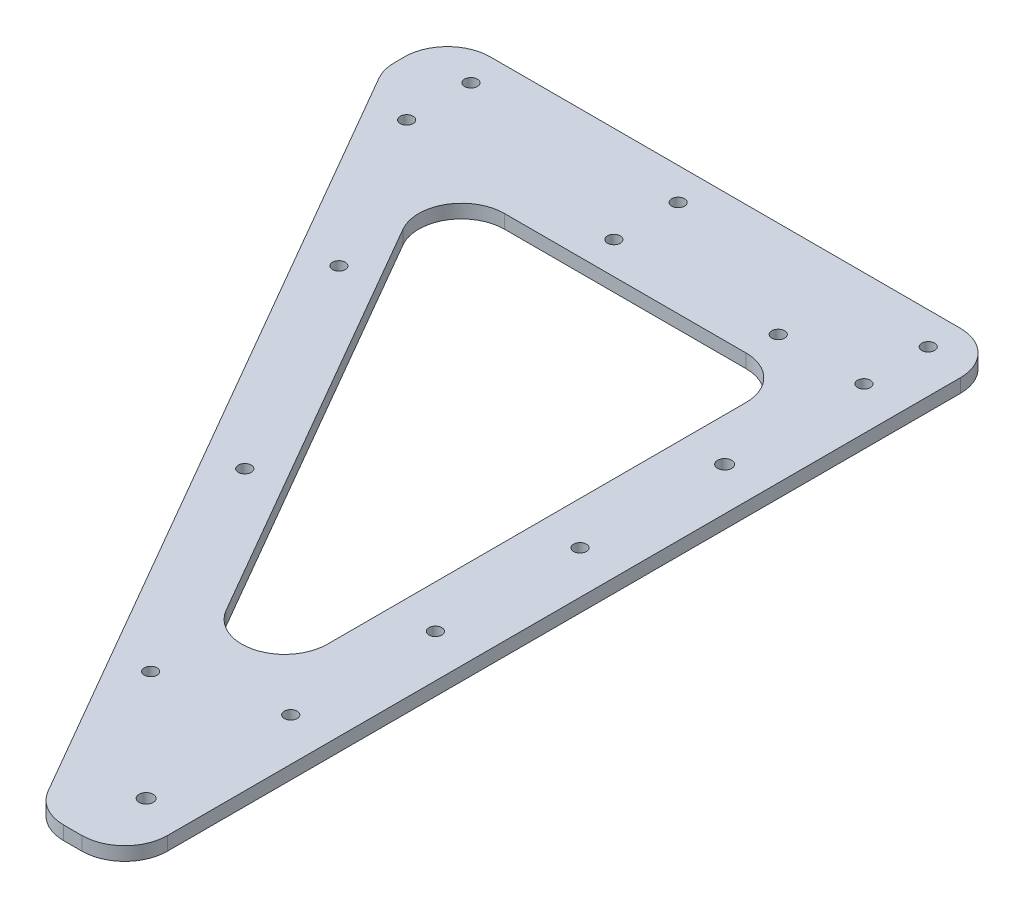
ISO-10303-21;
HEADER;
FILE_DESCRIPTION(('STEP AP214'),'2;1');
FILE_NAME('part.step','',(''),(''),'','','');
FILE_SCHEMA(('AUTOMOTIVE_DESIGN { 1 0 10303 214 1 1 1 1 }'));
ENDSEC;
DATA;
#1=APPLICATION_CONTEXT('core data for automotive mechanical design processes');
#2=APPLICATION_PROTOCOL_DEFINITION('international standard','automotive_design',2000,#1);
#3=PRODUCT_CONTEXT('',#1,'mechanical');
#4=PRODUCT('Part','Part','',(#3));
#5=PRODUCT_RELATED_PRODUCT_CATEGORY('part','',(#4));
#6=PRODUCT_DEFINITION_FORMATION('','',#4);
#7=PRODUCT_DEFINITION_CONTEXT('part definition',#1,'design');
#8=PRODUCT_DEFINITION('design','',#6,#7);
#9=PRODUCT_DEFINITION_SHAPE('','',#8);
#10=(LENGTH_UNIT() NAMED_UNIT(*) SI_UNIT(.MILLI.,.METRE.));
#11=(NAMED_UNIT(*) PLANE_ANGLE_UNIT() SI_UNIT($,.RADIAN.));
#12=(NAMED_UNIT(*) SI_UNIT($,.STERADIAN.) SOLID_ANGLE_UNIT());
#13=UNCERTAINTY_MEASURE_WITH_UNIT(LENGTH_MEASURE(1.E-05),#10,'distance_accuracy_value','');
#14=(GEOMETRIC_REPRESENTATION_CONTEXT(3) GLOBAL_UNCERTAINTY_ASSIGNED_CONTEXT((#13)) GLOBAL_UNIT_ASSIGNED_CONTEXT((#10,
#11,#12)) REPRESENTATION_CONTEXT('',''));
#15=CARTESIAN_POINT('',(0.,0.,0.));
#16=DIRECTION('',(0.,0.,1.));
#17=DIRECTION('',(1.,0.,0.));
#18=AXIS2_PLACEMENT_3D('',#15,#16,#17);
#19=CARTESIAN_POINT('',(-97.2724133595217,3.175,56.1602540378444));
#20=DIRECTION('',(-0.866025403784439,0.,0.5));
#21=DIRECTION('',(0.5,0.,0.866025403784439));
#22=AXIS2_PLACEMENT_3D('',#19,#20,#21);
#23=PLANE('',#22);
#24=DIRECTION('',(-0.5,0.,-0.866025403784439));
#25=VECTOR('',#24,1.);
#26=CARTESIAN_POINT('',(-97.2724133595217,0.,56.1602540378444));
#27=LINE('',#26,#25);
#28=CARTESIAN_POINT('',(-22.8867513459481,0.,185.));
#29=VERTEX_POINT('',#28);
#30=CARTESIAN_POINT('',(-128.356805183873,0.,2.32050807568877));
#31=VERTEX_POINT('',#30);
#32=EDGE_CURVE('E180',#29,#31,#27,.T.);
#33=ORIENTED_EDGE('',*,*,#32,.F.);
#34=DIRECTION('',(0.,-1.,0.));
#35=VECTOR('',#34,1.);
#36=CARTESIAN_POINT('',(-22.8867513459481,3.175,185.));
#37=LINE('',#36,#35);
#38=CARTESIAN_POINT('',(-22.8867513459481,3.175,185.));
#39=VERTEX_POINT('',#38);
#40=EDGE_CURVE('E160',#29,#39,#37,.F.);
#41=ORIENTED_EDGE('',*,*,#40,.T.);
#42=DIRECTION('',(-0.5,0.,-0.866025403784439));
#43=VECTOR('',#42,1.);
#44=CARTESIAN_POINT('',(-97.2724133595217,3.175,56.1602540378444));
#45=LINE('',#44,#43);
#46=CARTESIAN_POINT('',(-128.356805183873,3.175,2.32050807568877));
#47=VERTEX_POINT('',#46);
#48=EDGE_CURVE('E326',#39,#47,#45,.T.);
#49=ORIENTED_EDGE('',*,*,#48,.T.);
#50=DIRECTION('',(0.,-1.,0.));
#51=VECTOR('',#50,1.);
#52=CARTESIAN_POINT('',(-128.356805183873,3.175,2.32050807568877));
#53=LINE('',#52,#51);
#54=EDGE_CURVE('E258',#47,#31,#53,.T.);
#55=ORIENTED_EDGE('',*,*,#54,.T.);
#56=EDGE_LOOP('',(#33,#41,#49,#55));
#57=FACE_BOUND('',#56,.T.);
#58=ADVANCED_FACE('F35',(#57),#23,.T.);
#59=CARTESIAN_POINT('',(0.,3.175,190.));
#60=DIRECTION('',(0.,0.,1.));
#61=DIRECTION('',(1.,0.,0.));
#62=AXIS2_PLACEMENT_3D('',#59,#60,#61);
#63=PLANE('',#62);
#64=DIRECTION('',(-1.,0.,0.));
#65=VECTOR('',#64,1.);
#66=CARTESIAN_POINT('',(0.,0.,190.));
#67=LINE('',#66,#65);
#68=CARTESIAN_POINT('',(-9.99999999999998,0.,190.));
#69=VERTEX_POINT('',#68);
#70=CARTESIAN_POINT('',(-14.2264973081037,0.,190.));
#71=VERTEX_POINT('',#70);
#72=EDGE_CURVE('E188',#69,#71,#67,.T.);
#73=ORIENTED_EDGE('',*,*,#72,.F.);
#74=DIRECTION('',(0.,-1.,0.));
#75=VECTOR('',#74,1.);
#76=CARTESIAN_POINT('',(-9.99999999999998,3.175,190.));
#77=LINE('',#76,#75);
#78=CARTESIAN_POINT('',(-9.99999999999998,3.175,190.));
#79=VERTEX_POINT('',#78);
#80=EDGE_CURVE('E57',#69,#79,#77,.F.);
#81=ORIENTED_EDGE('',*,*,#80,.T.);
#82=DIRECTION('',(-1.,0.,0.));
#83=VECTOR('',#82,1.);
#84=CARTESIAN_POINT('',(0.,3.175,190.));
#85=LINE('',#84,#83);
#86=CARTESIAN_POINT('',(-14.2264973081037,3.175,190.));
#87=VERTEX_POINT('',#86);
#88=EDGE_CURVE('E324',#79,#87,#85,.T.);
#89=ORIENTED_EDGE('',*,*,#88,.T.);
#90=DIRECTION('',(0.,-1.,0.));
#91=VECTOR('',#90,1.);
#92=CARTESIAN_POINT('',(-14.2264973081037,3.175,190.));
#93=LINE('',#92,#91);
#94=EDGE_CURVE('E254',#87,#71,#93,.T.);
#95=ORIENTED_EDGE('',*,*,#94,.T.);
#96=EDGE_LOOP('',(#73,#81,#89,#95));
#97=FACE_BOUND('',#96,.T.);
#98=ADVANCED_FACE('F414',(#97),#63,.T.);
#99=CARTESIAN_POINT('',(0.,3.175,15.));
#100=DIRECTION('',(0.,0.,-1.));
#101=DIRECTION('',(-1.,0.,0.));
#102=AXIS2_PLACEMENT_3D('',#99,#100,#101);
#103=PLANE('',#102);
#104=DIRECTION('',(1.,0.,0.));
#105=VECTOR('',#104,1.);
#106=CARTESIAN_POINT('',(0.,0.,15.));
#107=LINE('',#106,#105);
#108=CARTESIAN_POINT('',(-86.3952809568069,0.,15.));
#109=VERTEX_POINT('',#108);
#110=CARTESIAN_POINT('',(-30.,0.,15.));
#111=VERTEX_POINT('',#110);
#112=EDGE_CURVE('E182',#109,#111,#107,.T.);
#113=ORIENTED_EDGE('',*,*,#112,.T.);
#114=DIRECTION('',(0.,-1.,0.));
#115=VECTOR('',#114,1.);
#116=CARTESIAN_POINT('',(-30.,3.175,15.));
#117=LINE('',#116,#115);
#118=CARTESIAN_POINT('',(-30.,3.175,15.));
#119=VERTEX_POINT('',#118);
#120=EDGE_CURVE('E218',#111,#119,#117,.F.);
#121=ORIENTED_EDGE('',*,*,#120,.T.);
#122=DIRECTION('',(1.,0.,0.));
#123=VECTOR('',#122,1.);
#124=CARTESIAN_POINT('',(0.,3.175,15.));
#125=LINE('',#124,#123);
#126=CARTESIAN_POINT('',(-86.3952809568069,3.175,15.));
#127=VERTEX_POINT('',#126);
#128=EDGE_CURVE('E275',#127,#119,#125,.T.);
#129=ORIENTED_EDGE('',*,*,#128,.F.);
#130=DIRECTION('',(0.,-1.,0.));
#131=VECTOR('',#130,1.);
#132=CARTESIAN_POINT('',(-86.3952809568069,0.,15.));
#133=LINE('',#132,#131);
#134=EDGE_CURVE('E215',#127,#109,#133,.T.);
#135=ORIENTED_EDGE('',*,*,#134,.T.);
#136=EDGE_LOOP('',(#113,#121,#129,#135));
#137=FACE_BOUND('',#136,.T.);
#138=ADVANCED_FACE('F285',(#137),#103,.F.);
#139=CARTESIAN_POINT('',(-20.,3.175,0.));
#140=DIRECTION('',(1.,0.,0.));
#141=DIRECTION('',(0.,0.,-1.));
#142=AXIS2_PLACEMENT_3D('',#139,#140,#141);
#143=PLANE('',#142);
#144=DIRECTION('',(0.,0.,1.));
#145=VECTOR('',#144,1.);
#146=CARTESIAN_POINT('',(-20.,0.,0.));
#147=LINE('',#146,#145);
#148=CARTESIAN_POINT('',(-20.,0.,25.));
#149=VERTEX_POINT('',#148);
#150=CARTESIAN_POINT('',(-20.,0.,122.679491924311));
#151=VERTEX_POINT('',#150);
#152=EDGE_CURVE('E177',#149,#151,#147,.T.);
#153=ORIENTED_EDGE('',*,*,#152,.T.);
#154=DIRECTION('',(0.,-1.,0.));
#155=VECTOR('',#154,1.);
#156=CARTESIAN_POINT('',(-20.,3.175,122.679491924311));
#157=LINE('',#156,#155);
#158=CARTESIAN_POINT('',(-20.,3.175,122.679491924311));
#159=VERTEX_POINT('',#158);
#160=EDGE_CURVE('E154',#151,#159,#157,.F.);
#161=ORIENTED_EDGE('',*,*,#160,.T.);
#162=DIRECTION('',(0.,0.,1.));
#163=VECTOR('',#162,1.);
#164=CARTESIAN_POINT('',(-20.,3.175,0.));
#165=LINE('',#164,#163);
#166=CARTESIAN_POINT('',(-20.,3.175,25.));
#167=VERTEX_POINT('',#166);
#168=EDGE_CURVE('E273',#167,#159,#165,.T.);
#169=ORIENTED_EDGE('',*,*,#168,.F.);
#170=DIRECTION('',(0.,-1.,0.));
#171=VECTOR('',#170,1.);
#172=CARTESIAN_POINT('',(-20.,0.,25.));
#173=LINE('',#172,#171);
#174=EDGE_CURVE('E170',#167,#149,#173,.T.);
#175=ORIENTED_EDGE('',*,*,#174,.T.);
#176=EDGE_LOOP('',(#153,#161,#169,#175));
#177=FACE_BOUND('',#176,.T.);
#178=ADVANCED_FACE('F280',(#177),#143,.F.);
#179=CARTESIAN_POINT('',(-9.99999999999997,3.175,40.));
#180=DIRECTION('',(0.,-1.,0.));
#181=DIRECTION('',(0.,0.,-1.));
#182=AXIS2_PLACEMENT_3D('',#179,#180,#181);
#183=CYLINDRICAL_SURFACE('',#182,1.65);
#184=CARTESIAN_POINT('',(-9.99999999999997,3.175,40.));
#185=DIRECTION('',(0.,1.,0.));
#186=DIRECTION('',(0.,0.,1.));
#187=AXIS2_PLACEMENT_3D('',#184,#185,#186);
#188=CIRCLE('',#187,1.65);
#189=CARTESIAN_POINT('',(-9.99999999999997,3.175,41.65));
#190=VERTEX_POINT('',#189);
#191=EDGE_CURVE('E309',#190,#190,#188,.T.);
#192=ORIENTED_EDGE('',*,*,#191,.T.);
#193=EDGE_LOOP('',(#192));
#194=FACE_BOUND('',#193,.T.);
#195=CARTESIAN_POINT('',(-9.99999999999997,0.,40.));
#196=DIRECTION('',(0.,1.,0.));
#197=DIRECTION('',(0.,0.,1.));
#198=AXIS2_PLACEMENT_3D('',#195,#196,#197);
#199=CIRCLE('',#198,1.65);
#200=CARTESIAN_POINT('',(-9.99999999999997,0.,41.65));
#201=VERTEX_POINT('',#200);
#202=EDGE_CURVE('E203',#201,#201,#199,.T.);
#203=ORIENTED_EDGE('',*,*,#202,.F.);
#204=EDGE_LOOP('',(#203));
#205=FACE_BOUND('',#204,.T.);
#206=ADVANCED_FACE('F434',(#194,#205),#183,.F.);
#207=CARTESIAN_POINT('',(-10.,3.175,141.25));
#208=DIRECTION('',(0.,-1.,0.));
#209=DIRECTION('',(0.,0.,-1.));
#210=AXIS2_PLACEMENT_3D('',#207,#208,#209);
#211=CYLINDRICAL_SURFACE('',#210,1.5);
#212=CARTESIAN_POINT('',(-10.,3.175,141.25));
#213=DIRECTION('',(0.,1.,0.));
#214=DIRECTION('',(0.,0.,1.));
#215=AXIS2_PLACEMENT_3D('',#212,#213,#214);
#216=CIRCLE('',#215,1.5);
#217=CARTESIAN_POINT('',(-10.,3.175,142.75));
#218=VERTEX_POINT('',#217);
#219=EDGE_CURVE('E312',#218,#218,#216,.T.);
#220=ORIENTED_EDGE('',*,*,#219,.T.);
#221=EDGE_LOOP('',(#220));
#222=FACE_BOUND('',#221,.T.);
#223=CARTESIAN_POINT('',(-10.,0.,141.25));
#224=DIRECTION('',(0.,1.,0.));
#225=DIRECTION('',(0.,0.,1.));
#226=AXIS2_PLACEMENT_3D('',#223,#224,#225);
#227=CIRCLE('',#226,1.5);
#228=CARTESIAN_POINT('',(-10.,0.,142.75));
#229=VERTEX_POINT('',#228);
#230=EDGE_CURVE('E200',#229,#229,#227,.T.);
#231=ORIENTED_EDGE('',*,*,#230,.F.);
#232=EDGE_LOOP('',(#231));
#233=FACE_BOUND('',#232,.T.);
#234=ADVANCED_FACE('F657',(#222,#233),#211,.F.);
#235=CARTESIAN_POINT('',(-9.99999999999997,3.175,107.5));
#236=DIRECTION('',(0.,-1.,0.));
#237=DIRECTION('',(0.,0.,-1.));
#238=AXIS2_PLACEMENT_3D('',#235,#236,#237);
#239=CYLINDRICAL_SURFACE('',#238,1.5);
#240=CARTESIAN_POINT('',(-9.99999999999997,3.175,107.5));
#241=DIRECTION('',(0.,1.,0.));
#242=DIRECTION('',(0.,0.,1.));
#243=AXIS2_PLACEMENT_3D('',#240,#241,#242);
#244=CIRCLE('',#243,1.5);
#245=CARTESIAN_POINT('',(-9.99999999999997,3.175,109.));
#246=VERTEX_POINT('',#245);
#247=EDGE_CURVE('E315',#246,#246,#244,.T.);
#248=ORIENTED_EDGE('',*,*,#247,.T.);
#249=EDGE_LOOP('',(#248));
#250=FACE_BOUND('',#249,.T.);
#251=CARTESIAN_POINT('',(-9.99999999999997,0.,107.5));
#252=DIRECTION('',(0.,1.,0.));
#253=DIRECTION('',(0.,0.,1.));
#254=AXIS2_PLACEMENT_3D('',#251,#252,#253);
#255=CIRCLE('',#254,1.5);
#256=CARTESIAN_POINT('',(-9.99999999999997,0.,109.));
#257=VERTEX_POINT('',#256);
#258=EDGE_CURVE('E197',#257,#257,#255,.T.);
#259=ORIENTED_EDGE('',*,*,#258,.F.);
#260=EDGE_LOOP('',(#259));
#261=FACE_BOUND('',#260,.T.);
#262=ADVANCED_FACE('F647',(#250,#261),#239,.F.);
#263=CARTESIAN_POINT('',(-10.,3.175,73.75));
#264=DIRECTION('',(0.,-1.,0.));
#265=DIRECTION('',(0.,0.,-1.));
#266=AXIS2_PLACEMENT_3D('',#263,#264,#265);
#267=CYLINDRICAL_SURFACE('',#266,1.5);
#268=CARTESIAN_POINT('',(-10.,3.175,73.75));
#269=DIRECTION('',(0.,1.,0.));
#270=DIRECTION('',(0.,0.,1.));
#271=AXIS2_PLACEMENT_3D('',#268,#269,#270);
#272=CIRCLE('',#271,1.5);
#273=CARTESIAN_POINT('',(-10.,3.175,75.25));
#274=VERTEX_POINT('',#273);
#275=EDGE_CURVE('E318',#274,#274,#272,.T.);
#276=ORIENTED_EDGE('',*,*,#275,.T.);
#277=EDGE_LOOP('',(#276));
#278=FACE_BOUND('',#277,.T.);
#279=CARTESIAN_POINT('',(-10.,0.,73.75));
#280=DIRECTION('',(0.,1.,0.));
#281=DIRECTION('',(0.,0.,1.));
#282=AXIS2_PLACEMENT_3D('',#279,#280,#281);
#283=CIRCLE('',#282,1.5);
#284=CARTESIAN_POINT('',(-10.,0.,75.25));
#285=VERTEX_POINT('',#284);
#286=EDGE_CURVE('E194',#285,#285,#283,.T.);
#287=ORIENTED_EDGE('',*,*,#286,.F.);
#288=EDGE_LOOP('',(#287));
#289=FACE_BOUND('',#288,.T.);
#290=ADVANCED_FACE('F642',(#278,#289),#267,.F.);
#291=CARTESIAN_POINT('',(0.,3.175,0.));
#292=DIRECTION('',(1.,0.,0.));
#293=DIRECTION('',(0.,0.,-1.));
#294=AXIS2_PLACEMENT_3D('',#291,#292,#293);
#295=PLANE('',#294);
#296=DIRECTION('',(0.,0.,1.));
#297=VECTOR('',#296,1.);
#298=CARTESIAN_POINT('',(0.,0.,0.));
#299=LINE('',#298,#297);
#300=CARTESIAN_POINT('',(0.,0.,-4.99999999999999));
#301=VERTEX_POINT('',#300);
#302=CARTESIAN_POINT('',(0.,0.,180.));
#303=VERTEX_POINT('',#302);
#304=EDGE_CURVE('E191',#301,#303,#299,.T.);
#305=ORIENTED_EDGE('',*,*,#304,.F.);
#306=DIRECTION('',(0.,-1.,0.));
#307=VECTOR('',#306,1.);
#308=CARTESIAN_POINT('',(0.,3.175,-4.99999999999999));
#309=LINE('',#308,#307);
#310=CARTESIAN_POINT('',(0.,3.175,-4.99999999999999));
#311=VERTEX_POINT('',#310);
#312=EDGE_CURVE('E252',#301,#311,#309,.F.);
#313=ORIENTED_EDGE('',*,*,#312,.T.);
#314=DIRECTION('',(0.,0.,1.));
#315=VECTOR('',#314,1.);
#316=CARTESIAN_POINT('',(0.,3.175,0.));
#317=LINE('',#316,#315);
#318=CARTESIAN_POINT('',(0.,3.175,180.));
#319=VERTEX_POINT('',#318);
#320=EDGE_CURVE('E321',#311,#319,#317,.T.);
#321=ORIENTED_EDGE('',*,*,#320,.T.);
#322=DIRECTION('',(0.,-1.,0.));
#323=VECTOR('',#322,1.);
#324=CARTESIAN_POINT('',(0.,3.175,180.));
#325=LINE('',#324,#323);
#326=EDGE_CURVE('E249',#319,#303,#325,.T.);
#327=ORIENTED_EDGE('',*,*,#326,.T.);
#328=EDGE_LOOP('',(#305,#313,#321,#327));
#329=FACE_BOUND('',#328,.T.);
#330=ADVANCED_FACE('F427',(#329),#295,.T.);
#331=CARTESIAN_POINT('',(-9.99999999999997,3.175,175.));
#332=DIRECTION('',(0.,-1.,0.));
#333=DIRECTION('',(0.,0.,-1.));
#334=AXIS2_PLACEMENT_3D('',#331,#332,#333);
#335=CYLINDRICAL_SURFACE('',#334,1.65);
#336=CARTESIAN_POINT('',(-9.99999999999997,3.175,175.));
#337=DIRECTION('',(0.,1.,0.));
#338=DIRECTION('',(0.,0.,1.));
#339=AXIS2_PLACEMENT_3D('',#336,#337,#338);
#340=CIRCLE('',#339,1.65);
#341=CARTESIAN_POINT('',(-9.99999999999997,3.175,176.65));
#342=VERTEX_POINT('',#341);
#343=EDGE_CURVE('E329',#342,#342,#340,.T.);
#344=ORIENTED_EDGE('',*,*,#343,.T.);
#345=EDGE_LOOP('',(#344));
#346=FACE_BOUND('',#345,.T.);
#347=CARTESIAN_POINT('',(-9.99999999999997,0.,175.));
#348=DIRECTION('',(0.,1.,0.));
#349=DIRECTION('',(0.,0.,1.));
#350=AXIS2_PLACEMENT_3D('',#347,#348,#349);
#351=CIRCLE('',#350,1.65);
#352=CARTESIAN_POINT('',(-9.99999999999997,0.,176.65));
#353=VERTEX_POINT('',#352);
#354=EDGE_CURVE('E176',#353,#353,#351,.T.);
#355=ORIENTED_EDGE('',*,*,#354,.F.);
#356=EDGE_LOOP('',(#355));
#357=FACE_BOUND('',#356,.T.);
#358=ADVANCED_FACE('F424',(#346,#357),#335,.F.);
#359=CARTESIAN_POINT('',(-84.2820323027551,3.175,48.6602540378444));
#360=DIRECTION('',(-0.866025403784439,0.,0.5));
#361=DIRECTION('',(0.5,0.,0.866025403784439));
#362=AXIS2_PLACEMENT_3D('',#359,#360,#361);
#363=PLANE('',#362);
#364=DIRECTION('',(-0.5,0.,-0.866025403784439));
#365=VECTOR('',#364,1.);
#366=CARTESIAN_POINT('',(-84.2820323027551,3.175,48.6602540378444));
#367=LINE('',#366,#365);
#368=CARTESIAN_POINT('',(-38.6602540378444,3.175,127.679491924311));
#369=VERTEX_POINT('',#368);
#370=CARTESIAN_POINT('',(-95.0555349946513,3.175,30.));
#371=VERTEX_POINT('',#370);
#372=EDGE_CURVE('E169',#369,#371,#367,.T.);
#373=ORIENTED_EDGE('',*,*,#372,.F.);
#374=DIRECTION('',(0.,-1.,0.));
#375=VECTOR('',#374,1.);
#376=CARTESIAN_POINT('',(-38.6602540378444,0.,127.679491924311));
#377=LINE('',#376,#375);
#378=CARTESIAN_POINT('',(-38.6602540378444,0.,127.679491924311));
#379=VERTEX_POINT('',#378);
#380=EDGE_CURVE('E153',#369,#379,#377,.T.);
#381=ORIENTED_EDGE('',*,*,#380,.T.);
#382=DIRECTION('',(-0.5,0.,-0.866025403784439));
#383=VECTOR('',#382,1.);
#384=CARTESIAN_POINT('',(-84.2820323027551,0.,48.6602540378444));
#385=LINE('',#384,#383);
#386=CARTESIAN_POINT('',(-95.0555349946513,0.,30.));
#387=VERTEX_POINT('',#386);
#388=EDGE_CURVE('E166',#379,#387,#385,.T.);
#389=ORIENTED_EDGE('',*,*,#388,.T.);
#390=DIRECTION('',(0.,-1.,0.));
#391=VECTOR('',#390,1.);
#392=CARTESIAN_POINT('',(-95.0555349946513,3.175,30.));
#393=LINE('',#392,#391);
#394=EDGE_CURVE('E171',#387,#371,#393,.F.);
#395=ORIENTED_EDGE('',*,*,#394,.T.);
#396=EDGE_LOOP('',(#373,#381,#389,#395));
#397=FACE_BOUND('',#396,.T.);
#398=ADVANCED_FACE('F165',(#397),#363,.F.);
#399=CARTESIAN_POINT('',(-35.1054897804395,3.175,148.836524227066));
#400=DIRECTION('',(0.,-1.,0.));
#401=DIRECTION('',(0.,0.,-1.));
#402=AXIS2_PLACEMENT_3D('',#399,#400,#401);
#403=CYLINDRICAL_SURFACE('',#402,1.5);
#404=CARTESIAN_POINT('',(-35.1054897804395,3.175,148.836524227066));
#405=DIRECTION('',(0.,1.,0.));
#406=DIRECTION('',(0.,0.,1.));
#407=AXIS2_PLACEMENT_3D('',#404,#405,#406);
#408=CIRCLE('',#407,1.5);
#409=CARTESIAN_POINT('',(-35.1054897804395,3.175,150.336524227066));
#410=VERTEX_POINT('',#409);
#411=EDGE_CURVE('E334',#410,#410,#408,.T.);
#412=ORIENTED_EDGE('',*,*,#411,.T.);
#413=EDGE_LOOP('',(#412));
#414=FACE_BOUND('',#413,.T.);
#415=CARTESIAN_POINT('',(-35.1054897804395,0.,148.836524227066));
#416=DIRECTION('',(0.,1.,0.));
#417=DIRECTION('',(0.,0.,1.));
#418=AXIS2_PLACEMENT_3D('',#415,#416,#417);
#419=CIRCLE('',#418,1.5);
#420=CARTESIAN_POINT('',(-35.1054897804395,0.,150.336524227066));
#421=VERTEX_POINT('',#420);
#422=EDGE_CURVE('E287',#421,#421,#419,.T.);
#423=ORIENTED_EDGE('',*,*,#422,.F.);
#424=EDGE_LOOP('',(#423));
#425=FACE_BOUND('',#424,.T.);
#426=ADVANCED_FACE('F431',(#414,#425),#403,.F.);
#427=CARTESIAN_POINT('',(-65.1054897804395,3.175,96.875));
#428=DIRECTION('',(0.,-1.,0.));
#429=DIRECTION('',(0.,0.,-1.));
#430=AXIS2_PLACEMENT_3D('',#427,#428,#429);
#431=CYLINDRICAL_SURFACE('',#430,1.5);
#432=CARTESIAN_POINT('',(-65.1054897804395,3.175,96.875));
#433=DIRECTION('',(0.,1.,0.));
#434=DIRECTION('',(0.,0.,1.));
#435=AXIS2_PLACEMENT_3D('',#432,#433,#434);
#436=CIRCLE('',#435,1.5);
#437=CARTESIAN_POINT('',(-65.1054897804395,3.175,98.375));
#438=VERTEX_POINT('',#437);
#439=EDGE_CURVE('E337',#438,#438,#436,.T.);
#440=ORIENTED_EDGE('',*,*,#439,.T.);
#441=EDGE_LOOP('',(#440));
#442=FACE_BOUND('',#441,.T.);
#443=CARTESIAN_POINT('',(-65.1054897804395,0.,96.875));
#444=DIRECTION('',(0.,1.,0.));
#445=DIRECTION('',(0.,0.,1.));
#446=AXIS2_PLACEMENT_3D('',#443,#444,#445);
#447=CIRCLE('',#446,1.5);
#448=CARTESIAN_POINT('',(-65.1054897804395,0.,98.375));
#449=VERTEX_POINT('',#448);
#450=EDGE_CURVE('E289',#449,#449,#447,.T.);
#451=ORIENTED_EDGE('',*,*,#450,.F.);
#452=EDGE_LOOP('',(#451));
#453=FACE_BOUND('',#452,.T.);
#454=ADVANCED_FACE('F439',(#442,#453),#431,.F.);
#455=CARTESIAN_POINT('',(-95.1054897804395,3.175,44.9134757729337));
#456=DIRECTION('',(0.,-1.,0.));
#457=DIRECTION('',(0.,0.,-1.));
#458=AXIS2_PLACEMENT_3D('',#455,#456,#457);
#459=CYLINDRICAL_SURFACE('',#458,1.5);
#460=CARTESIAN_POINT('',(-95.1054897804395,3.175,44.9134757729337));
#461=DIRECTION('',(0.,1.,0.));
#462=DIRECTION('',(0.,0.,1.));
#463=AXIS2_PLACEMENT_3D('',#460,#461,#462);
#464=CIRCLE('',#463,1.5);
#465=CARTESIAN_POINT('',(-95.1054897804395,3.175,46.4134757729337));
#466=VERTEX_POINT('',#465);
#467=EDGE_CURVE('E340',#466,#466,#464,.T.);
#468=ORIENTED_EDGE('',*,*,#467,.T.);
#469=EDGE_LOOP('',(#468));
#470=FACE_BOUND('',#469,.T.);
#471=CARTESIAN_POINT('',(-95.1054897804395,0.,44.9134757729337));
#472=DIRECTION('',(0.,1.,0.));
#473=DIRECTION('',(0.,0.,1.));
#474=AXIS2_PLACEMENT_3D('',#471,#472,#473);
#475=CIRCLE('',#474,1.5);
#476=CARTESIAN_POINT('',(-95.1054897804395,0.,46.4134757729337));
#477=VERTEX_POINT('',#476);
#478=EDGE_CURVE('E294',#477,#477,#475,.T.);
#479=ORIENTED_EDGE('',*,*,#478,.F.);
#480=EDGE_LOOP('',(#479));
#481=FACE_BOUND('',#480,.T.);
#482=ADVANCED_FACE('F443',(#470,#481),#459,.F.);
#483=CARTESIAN_POINT('',(-116.706170089262,3.175,7.50000000000002));
#484=DIRECTION('',(0.,-1.,0.));
#485=DIRECTION('',(0.,0.,-1.));
#486=AXIS2_PLACEMENT_3D('',#483,#484,#485);
#487=CYLINDRICAL_SURFACE('',#486,1.5);
#488=CARTESIAN_POINT('',(-116.706170089262,3.175,7.50000000000002));
#489=DIRECTION('',(0.,1.,0.));
#490=DIRECTION('',(0.,0.,1.));
#491=AXIS2_PLACEMENT_3D('',#488,#489,#490);
#492=CIRCLE('',#491,1.5);
#493=CARTESIAN_POINT('',(-116.706170089262,3.175,9.00000000000002));
#494=VERTEX_POINT('',#493);
#495=EDGE_CURVE('E343',#494,#494,#492,.T.);
#496=ORIENTED_EDGE('',*,*,#495,.T.);
#497=EDGE_LOOP('',(#496));
#498=FACE_BOUND('',#497,.T.);
#499=CARTESIAN_POINT('',(-116.706170089262,0.,7.50000000000002));
#500=DIRECTION('',(0.,1.,0.));
#501=DIRECTION('',(0.,0.,1.));
#502=AXIS2_PLACEMENT_3D('',#499,#500,#501);
#503=CIRCLE('',#502,1.5);
#504=CARTESIAN_POINT('',(-116.706170089262,0.,9.00000000000002));
#505=VERTEX_POINT('',#504);
#506=EDGE_CURVE('E297',#505,#505,#503,.T.);
#507=ORIENTED_EDGE('',*,*,#506,.F.);
#508=EDGE_LOOP('',(#507));
#509=FACE_BOUND('',#508,.T.);
#510=ADVANCED_FACE('F447',(#498,#509),#487,.F.);
#511=CARTESIAN_POINT('',(-68.3530850446312,3.175,7.50000000000002));
#512=DIRECTION('',(0.,-1.,0.));
#513=DIRECTION('',(0.,0.,-1.));
#514=AXIS2_PLACEMENT_3D('',#511,#512,#513);
#515=CYLINDRICAL_SURFACE('',#514,1.5);
#516=CARTESIAN_POINT('',(-68.3530850446312,3.175,7.50000000000002));
#517=DIRECTION('',(0.,1.,0.));
#518=DIRECTION('',(0.,0.,1.));
#519=AXIS2_PLACEMENT_3D('',#516,#517,#518);
#520=CIRCLE('',#519,1.5);
#521=CARTESIAN_POINT('',(-68.3530850446312,3.175,9.00000000000002));
#522=VERTEX_POINT('',#521);
#523=EDGE_CURVE('E346',#522,#522,#520,.T.);
#524=ORIENTED_EDGE('',*,*,#523,.T.);
#525=EDGE_LOOP('',(#524));
#526=FACE_BOUND('',#525,.T.);
#527=CARTESIAN_POINT('',(-68.3530850446312,0.,7.50000000000002));
#528=DIRECTION('',(0.,1.,0.));
#529=DIRECTION('',(0.,0.,1.));
#530=AXIS2_PLACEMENT_3D('',#527,#528,#529);
#531=CIRCLE('',#530,1.5);
#532=CARTESIAN_POINT('',(-68.3530850446312,0.,9.00000000000002));
#533=VERTEX_POINT('',#532);
#534=EDGE_CURVE('E300',#533,#533,#531,.T.);
#535=ORIENTED_EDGE('',*,*,#534,.F.);
#536=EDGE_LOOP('',(#535));
#537=FACE_BOUND('',#536,.T.);
#538=ADVANCED_FACE('F451',(#526,#537),#515,.F.);
#539=CARTESIAN_POINT('',(-30.,3.175,7.50000000000002));
#540=DIRECTION('',(0.,-1.,0.));
#541=DIRECTION('',(0.,0.,-1.));
#542=AXIS2_PLACEMENT_3D('',#539,#540,#541);
#543=CYLINDRICAL_SURFACE('',#542,1.5);
#544=CARTESIAN_POINT('',(-30.,3.175,7.50000000000002));
#545=DIRECTION('',(0.,1.,0.));
#546=DIRECTION('',(0.,0.,1.));
#547=AXIS2_PLACEMENT_3D('',#544,#545,#546);
#548=CIRCLE('',#547,1.5);
#549=CARTESIAN_POINT('',(-30.,3.175,9.00000000000002));
#550=VERTEX_POINT('',#549);
#551=EDGE_CURVE('E209',#550,#550,#548,.T.);
#552=ORIENTED_EDGE('',*,*,#551,.T.);
#553=EDGE_LOOP('',(#552));
#554=FACE_BOUND('',#553,.T.);
#555=CARTESIAN_POINT('',(-30.,0.,7.50000000000002));
#556=DIRECTION('',(0.,1.,0.));
#557=DIRECTION('',(0.,0.,1.));
#558=AXIS2_PLACEMENT_3D('',#555,#556,#557);
#559=CIRCLE('',#558,1.5);
#560=CARTESIAN_POINT('',(-30.,0.,9.00000000000002));
#561=VERTEX_POINT('',#560);
#562=EDGE_CURVE('E303',#561,#561,#559,.T.);
#563=ORIENTED_EDGE('',*,*,#562,.F.);
#564=EDGE_LOOP('',(#563));
#565=FACE_BOUND('',#564,.T.);
#566=ADVANCED_FACE('F455',(#554,#565),#543,.F.);
#567=CARTESIAN_POINT('',(-9.99999999999997,3.175,7.50000000000002));
#568=DIRECTION('',(0.,-1.,0.));
#569=DIRECTION('',(0.,0.,-1.));
#570=AXIS2_PLACEMENT_3D('',#567,#568,#569);
#571=CYLINDRICAL_SURFACE('',#570,1.5);
#572=CARTESIAN_POINT('',(-9.99999999999997,3.175,7.50000000000002));
#573=DIRECTION('',(0.,1.,0.));
#574=DIRECTION('',(0.,0.,1.));
#575=AXIS2_PLACEMENT_3D('',#572,#573,#574);
#576=CIRCLE('',#575,1.5);
#577=CARTESIAN_POINT('',(-9.99999999999997,3.175,9.00000000000002));
#578=VERTEX_POINT('',#577);
#579=EDGE_CURVE('E210',#578,#578,#576,.T.);
#580=ORIENTED_EDGE('',*,*,#579,.T.);
#581=EDGE_LOOP('',(#580));
#582=FACE_BOUND('',#581,.T.);
#583=CARTESIAN_POINT('',(-9.99999999999997,0.,7.50000000000002));
#584=DIRECTION('',(0.,1.,0.));
#585=DIRECTION('',(0.,0.,1.));
#586=AXIS2_PLACEMENT_3D('',#583,#584,#585);
#587=CIRCLE('',#586,1.5);
#588=CARTESIAN_POINT('',(-9.99999999999997,0.,9.00000000000002));
#589=VERTEX_POINT('',#588);
#590=EDGE_CURVE('E206',#589,#589,#587,.T.);
#591=ORIENTED_EDGE('',*,*,#590,.F.);
#592=EDGE_LOOP('',(#591));
#593=FACE_BOUND('',#592,.T.);
#594=ADVANCED_FACE('F459',(#582,#593),#571,.F.);
#595=CARTESIAN_POINT('',(0.,3.175,0.));
#596=DIRECTION('',(0.,1.,0.));
#597=DIRECTION('',(0.,0.,1.));
#598=AXIS2_PLACEMENT_3D('',#595,#596,#597);
#599=PLANE('',#598);
#600=ORIENTED_EDGE('',*,*,#551,.F.);
#601=EDGE_LOOP('',(#600));
#602=FACE_BOUND('',#601,.T.);
#603=ORIENTED_EDGE('',*,*,#523,.F.);
#604=EDGE_LOOP('',(#603));
#605=FACE_BOUND('',#604,.T.);
#606=ORIENTED_EDGE('',*,*,#495,.F.);
#607=EDGE_LOOP('',(#606));
#608=FACE_BOUND('',#607,.T.);
#609=ORIENTED_EDGE('',*,*,#467,.F.);
#610=EDGE_LOOP('',(#609));
#611=FACE_BOUND('',#610,.T.);
#612=ORIENTED_EDGE('',*,*,#439,.F.);
#613=EDGE_LOOP('',(#612));
#614=FACE_BOUND('',#613,.T.);
#615=ORIENTED_EDGE('',*,*,#411,.F.);
#616=EDGE_LOOP('',(#615));
#617=FACE_BOUND('',#616,.T.);
#618=ORIENTED_EDGE('',*,*,#372,.T.);
#619=CARTESIAN_POINT('',(-86.3952809568069,3.175,25.));
#620=DIRECTION('',(0.,1.,0.));
#621=DIRECTION('',(0.,0.,1.));
#622=AXIS2_PLACEMENT_3D('',#619,#620,#621);
#623=CIRCLE('',#622,10.);
#624=EDGE_CURVE('E11',#371,#127,#623,.F.);
#625=ORIENTED_EDGE('',*,*,#624,.T.);
#626=ORIENTED_EDGE('',*,*,#128,.T.);
#627=CARTESIAN_POINT('',(-30.,3.175,25.));
#628=DIRECTION('',(0.,1.,0.));
#629=DIRECTION('',(0.,0.,1.));
#630=AXIS2_PLACEMENT_3D('',#627,#628,#629);
#631=CIRCLE('',#630,10.);
#632=EDGE_CURVE('E265',#119,#167,#631,.F.);
#633=ORIENTED_EDGE('',*,*,#632,.T.);
#634=ORIENTED_EDGE('',*,*,#168,.T.);
#635=CARTESIAN_POINT('',(-30.,3.175,122.679491924311));
#636=DIRECTION('',(0.,1.,0.));
#637=DIRECTION('',(0.,0.,1.));
#638=AXIS2_PLACEMENT_3D('',#635,#636,#637);
#639=CIRCLE('',#638,10.);
#640=EDGE_CURVE('E159',#159,#369,#639,.F.);
#641=ORIENTED_EDGE('',*,*,#640,.T.);
#642=EDGE_LOOP('',(#618,#625,#626,#633,#634,#641));
#643=FACE_BOUND('',#642,.T.);
#644=ORIENTED_EDGE('',*,*,#343,.F.);
#645=EDGE_LOOP('',(#644));
#646=FACE_BOUND('',#645,.T.);
#647=DIRECTION('',(1.,0.,0.));
#648=VECTOR('',#647,1.);
#649=CARTESIAN_POINT('',(0.,3.175,-15.));
#650=LINE('',#649,#648);
#651=CARTESIAN_POINT('',(-119.696551146029,3.175,-15.));
#652=VERTEX_POINT('',#651);
#653=CARTESIAN_POINT('',(-10.,3.175,-15.));
#654=VERTEX_POINT('',#653);
#655=EDGE_CURVE('E306',#652,#654,#650,.T.);
#656=ORIENTED_EDGE('',*,*,#655,.F.);
#657=CARTESIAN_POINT('',(-119.696551146029,3.175,-4.99999999999999));
#658=DIRECTION('',(0.,1.,0.));
#659=DIRECTION('',(0.,0.,1.));
#660=AXIS2_PLACEMENT_3D('',#657,#658,#659);
#661=CIRCLE('',#660,10.);
#662=CARTESIAN_POINT('',(-129.696551146029,3.175,-4.99999999999999));
#663=VERTEX_POINT('',#662);
#664=EDGE_CURVE('E247',#652,#663,#661,.T.);
#665=ORIENTED_EDGE('',*,*,#664,.T.);
#666=DIRECTION('',(0.,0.,-1.));
#667=VECTOR('',#666,1.);
#668=CARTESIAN_POINT('',(-129.696551146029,3.175,0.));
#669=LINE('',#668,#667);
#670=CARTESIAN_POINT('',(-129.696551146029,3.175,-2.67949192431124));
#671=VERTEX_POINT('',#670);
#672=EDGE_CURVE('E369',#671,#663,#669,.T.);
#673=ORIENTED_EDGE('',*,*,#672,.F.);
#674=CARTESIAN_POINT('',(-119.696551146029,3.175,-2.67949192431124));
#675=DIRECTION('',(0.,1.,0.));
#676=DIRECTION('',(0.,0.,1.));
#677=AXIS2_PLACEMENT_3D('',#674,#675,#676);
#678=CIRCLE('',#677,10.);
#679=EDGE_CURVE('E240',#671,#47,#678,.T.);
#680=ORIENTED_EDGE('',*,*,#679,.T.);
#681=ORIENTED_EDGE('',*,*,#48,.F.);
#682=CARTESIAN_POINT('',(-14.2264973081037,3.175,180.));
#683=DIRECTION('',(0.,1.,0.));
#684=DIRECTION('',(0.,0.,1.));
#685=AXIS2_PLACEMENT_3D('',#682,#683,#684);
#686=CIRCLE('',#685,10.);
#687=EDGE_CURVE('E50',#39,#87,#686,.T.);
#688=ORIENTED_EDGE('',*,*,#687,.T.);
#689=ORIENTED_EDGE('',*,*,#88,.F.);
#690=CARTESIAN_POINT('',(-9.99999999999998,3.175,180.));
#691=DIRECTION('',(0.,1.,0.));
#692=DIRECTION('',(0.,0.,1.));
#693=AXIS2_PLACEMENT_3D('',#690,#691,#692);
#694=CIRCLE('',#693,10.);
#695=EDGE_CURVE('E243',#79,#319,#694,.T.);
#696=ORIENTED_EDGE('',*,*,#695,.T.);
#697=ORIENTED_EDGE('',*,*,#320,.F.);
#698=CARTESIAN_POINT('',(-10.,3.175,-4.99999999999999));
#699=DIRECTION('',(0.,1.,0.));
#700=DIRECTION('',(0.,0.,1.));
#701=AXIS2_PLACEMENT_3D('',#698,#699,#700);
#702=CIRCLE('',#701,10.);
#703=EDGE_CURVE('E245',#311,#654,#702,.T.);
#704=ORIENTED_EDGE('',*,*,#703,.T.);
#705=EDGE_LOOP('',(#656,#665,#673,#680,#681,#688,#689,#696,#697,#704));
#706=FACE_BOUND('',#705,.T.);
#707=ORIENTED_EDGE('',*,*,#275,.F.);
#708=EDGE_LOOP('',(#707));
#709=FACE_BOUND('',#708,.T.);
#710=ORIENTED_EDGE('',*,*,#247,.F.);
#711=EDGE_LOOP('',(#710));
#712=FACE_BOUND('',#711,.T.);
#713=ORIENTED_EDGE('',*,*,#219,.F.);
#714=EDGE_LOOP('',(#713));
#715=FACE_BOUND('',#714,.T.);
#716=ORIENTED_EDGE('',*,*,#191,.F.);
#717=EDGE_LOOP('',(#716));
#718=FACE_BOUND('',#717,.T.);
#719=ORIENTED_EDGE('',*,*,#579,.F.);
#720=EDGE_LOOP('',(#719));
#721=FACE_BOUND('',#720,.T.);
#722=CARTESIAN_POINT('',(-9.99999999999997,3.175,-7.49999999999998));
#723=DIRECTION('',(0.,-1.,0.));
#724=DIRECTION('',(0.,0.,-1.));
#725=AXIS2_PLACEMENT_3D('',#722,#723,#724);
#726=CIRCLE('',#725,1.5);
#727=CARTESIAN_POINT('',(-9.99999999999997,3.175,-8.99999999999998));
#728=VERTEX_POINT('',#727);
#729=EDGE_CURVE('E354',#728,#728,#726,.T.);
#730=ORIENTED_EDGE('',*,*,#729,.T.);
#731=EDGE_LOOP('',(#730));
#732=FACE_BOUND('',#731,.T.);
#733=CARTESIAN_POINT('',(-68.3530850446312,3.175,-7.49999999999998));
#734=DIRECTION('',(0.,-1.,0.));
#735=DIRECTION('',(0.,0.,-1.));
#736=AXIS2_PLACEMENT_3D('',#733,#734,#735);
#737=CIRCLE('',#736,1.5);
#738=CARTESIAN_POINT('',(-68.3530850446312,3.175,-8.99999999999998));
#739=VERTEX_POINT('',#738);
#740=EDGE_CURVE('E375',#739,#739,#737,.T.);
#741=ORIENTED_EDGE('',*,*,#740,.T.);
#742=EDGE_LOOP('',(#741));
#743=FACE_BOUND('',#742,.T.);
#744=CARTESIAN_POINT('',(-116.706170089262,3.175,-7.49999999999998));
#745=DIRECTION('',(0.,-1.,0.));
#746=DIRECTION('',(0.,0.,-1.));
#747=AXIS2_PLACEMENT_3D('',#744,#745,#746);
#748=CIRCLE('',#747,1.5);
#749=CARTESIAN_POINT('',(-116.706170089262,3.175,-8.99999999999998));
#750=VERTEX_POINT('',#749);
#751=EDGE_CURVE('E372',#750,#750,#748,.T.);
#752=ORIENTED_EDGE('',*,*,#751,.T.);
#753=EDGE_LOOP('',(#752));
#754=FACE_BOUND('',#753,.T.);
#755=ADVANCED_FACE('F271',(#602,#605,#608,#611,#614,#617,#643,#646,#706,#709,#712,#715,#718,
#721,#732,#743,#754),#599,.T.);
#756=CARTESIAN_POINT('',(0.,0.,0.));
#757=DIRECTION('',(0.,1.,0.));
#758=DIRECTION('',(0.,0.,1.));
#759=AXIS2_PLACEMENT_3D('',#756,#757,#758);
#760=PLANE('',#759);
#761=ORIENTED_EDGE('',*,*,#562,.T.);
#762=EDGE_LOOP('',(#761));
#763=FACE_BOUND('',#762,.T.);
#764=ORIENTED_EDGE('',*,*,#534,.T.);
#765=EDGE_LOOP('',(#764));
#766=FACE_BOUND('',#765,.T.);
#767=ORIENTED_EDGE('',*,*,#506,.T.);
#768=EDGE_LOOP('',(#767));
#769=FACE_BOUND('',#768,.T.);
#770=ORIENTED_EDGE('',*,*,#478,.T.);
#771=EDGE_LOOP('',(#770));
#772=FACE_BOUND('',#771,.T.);
#773=ORIENTED_EDGE('',*,*,#450,.T.);
#774=EDGE_LOOP('',(#773));
#775=FACE_BOUND('',#774,.T.);
#776=ORIENTED_EDGE('',*,*,#422,.T.);
#777=EDGE_LOOP('',(#776));
#778=FACE_BOUND('',#777,.T.);
#779=ORIENTED_EDGE('',*,*,#112,.F.);
#780=CARTESIAN_POINT('',(-86.3952809568069,0.,25.));
#781=DIRECTION('',(0.,1.,0.));
#782=DIRECTION('',(0.,0.,1.));
#783=AXIS2_PLACEMENT_3D('',#780,#781,#782);
#784=CIRCLE('',#783,10.);
#785=EDGE_CURVE('E43',#109,#387,#784,.T.);
#786=ORIENTED_EDGE('',*,*,#785,.T.);
#787=ORIENTED_EDGE('',*,*,#388,.F.);
#788=CARTESIAN_POINT('',(-30.,0.,122.679491924311));
#789=DIRECTION('',(0.,1.,0.));
#790=DIRECTION('',(0.,0.,1.));
#791=AXIS2_PLACEMENT_3D('',#788,#789,#790);
#792=CIRCLE('',#791,10.);
#793=EDGE_CURVE('E149',#379,#151,#792,.T.);
#794=ORIENTED_EDGE('',*,*,#793,.T.);
#795=ORIENTED_EDGE('',*,*,#152,.F.);
#796=CARTESIAN_POINT('',(-30.,0.,25.));
#797=DIRECTION('',(0.,1.,0.));
#798=DIRECTION('',(0.,0.,1.));
#799=AXIS2_PLACEMENT_3D('',#796,#797,#798);
#800=CIRCLE('',#799,10.);
#801=EDGE_CURVE('E263',#149,#111,#800,.T.);
#802=ORIENTED_EDGE('',*,*,#801,.T.);
#803=EDGE_LOOP('',(#779,#786,#787,#794,#795,#802));
#804=FACE_BOUND('',#803,.T.);
#805=ORIENTED_EDGE('',*,*,#354,.T.);
#806=EDGE_LOOP('',(#805));
#807=FACE_BOUND('',#806,.T.);
#808=DIRECTION('',(0.,0.,-1.));
#809=VECTOR('',#808,1.);
#810=CARTESIAN_POINT('',(-129.696551146029,0.,0.));
#811=LINE('',#810,#809);
#812=CARTESIAN_POINT('',(-129.696551146029,0.,-2.67949192431124));
#813=VERTEX_POINT('',#812);
#814=CARTESIAN_POINT('',(-129.696551146029,0.,-4.99999999999999));
#815=VERTEX_POINT('',#814);
#816=EDGE_CURVE('E355',#813,#815,#811,.T.);
#817=ORIENTED_EDGE('',*,*,#816,.T.);
#818=CARTESIAN_POINT('',(-119.696551146029,0.,-4.99999999999999));
#819=DIRECTION('',(0.,1.,0.));
#820=DIRECTION('',(0.,0.,1.));
#821=AXIS2_PLACEMENT_3D('',#818,#819,#820);
#822=CIRCLE('',#821,10.);
#823=CARTESIAN_POINT('',(-119.696551146029,0.,-15.));
#824=VERTEX_POINT('',#823);
#825=EDGE_CURVE('E233',#815,#824,#822,.F.);
#826=ORIENTED_EDGE('',*,*,#825,.T.);
#827=DIRECTION('',(1.,0.,0.));
#828=VECTOR('',#827,1.);
#829=CARTESIAN_POINT('',(0.,0.,-15.));
#830=LINE('',#829,#828);
#831=CARTESIAN_POINT('',(-10.,0.,-15.));
#832=VERTEX_POINT('',#831);
#833=EDGE_CURVE('E351',#824,#832,#830,.T.);
#834=ORIENTED_EDGE('',*,*,#833,.T.);
#835=CARTESIAN_POINT('',(-10.,0.,-4.99999999999999));
#836=DIRECTION('',(0.,1.,0.));
#837=DIRECTION('',(0.,0.,1.));
#838=AXIS2_PLACEMENT_3D('',#835,#836,#837);
#839=CIRCLE('',#838,10.);
#840=EDGE_CURVE('E231',#832,#301,#839,.F.);
#841=ORIENTED_EDGE('',*,*,#840,.T.);
#842=ORIENTED_EDGE('',*,*,#304,.T.);
#843=CARTESIAN_POINT('',(-9.99999999999998,0.,180.));
#844=DIRECTION('',(0.,1.,0.));
#845=DIRECTION('',(0.,0.,1.));
#846=AXIS2_PLACEMENT_3D('',#843,#844,#845);
#847=CIRCLE('',#846,10.);
#848=EDGE_CURVE('E229',#303,#69,#847,.F.);
#849=ORIENTED_EDGE('',*,*,#848,.T.);
#850=ORIENTED_EDGE('',*,*,#72,.T.);
#851=CARTESIAN_POINT('',(-14.2264973081037,0.,180.));
#852=DIRECTION('',(0.,1.,0.));
#853=DIRECTION('',(0.,0.,1.));
#854=AXIS2_PLACEMENT_3D('',#851,#852,#853);
#855=CIRCLE('',#854,10.);
#856=EDGE_CURVE('E227',#71,#29,#855,.F.);
#857=ORIENTED_EDGE('',*,*,#856,.T.);
#858=ORIENTED_EDGE('',*,*,#32,.T.);
#859=CARTESIAN_POINT('',(-119.696551146029,0.,-2.67949192431124));
#860=DIRECTION('',(0.,1.,0.));
#861=DIRECTION('',(0.,0.,1.));
#862=AXIS2_PLACEMENT_3D('',#859,#860,#861);
#863=CIRCLE('',#862,10.);
#864=EDGE_CURVE('E225',#31,#813,#863,.F.);
#865=ORIENTED_EDGE('',*,*,#864,.T.);
#866=EDGE_LOOP('',(#817,#826,#834,#841,#842,#849,#850,#857,#858,#865));
#867=FACE_BOUND('',#866,.T.);
#868=ORIENTED_EDGE('',*,*,#286,.T.);
#869=EDGE_LOOP('',(#868));
#870=FACE_BOUND('',#869,.T.);
#871=ORIENTED_EDGE('',*,*,#258,.T.);
#872=EDGE_LOOP('',(#871));
#873=FACE_BOUND('',#872,.T.);
#874=ORIENTED_EDGE('',*,*,#230,.T.);
#875=EDGE_LOOP('',(#874));
#876=FACE_BOUND('',#875,.T.);
#877=ORIENTED_EDGE('',*,*,#202,.T.);
#878=EDGE_LOOP('',(#877));
#879=FACE_BOUND('',#878,.T.);
#880=ORIENTED_EDGE('',*,*,#590,.T.);
#881=EDGE_LOOP('',(#880));
#882=FACE_BOUND('',#881,.T.);
#883=CARTESIAN_POINT('',(-9.99999999999997,0.,-7.49999999999998));
#884=DIRECTION('',(0.,-1.,0.));
#885=DIRECTION('',(0.,0.,-1.));
#886=AXIS2_PLACEMENT_3D('',#883,#884,#885);
#887=CIRCLE('',#886,1.5);
#888=CARTESIAN_POINT('',(-9.99999999999997,0.,-8.99999999999998));
#889=VERTEX_POINT('',#888);
#890=EDGE_CURVE('E364',#889,#889,#887,.T.);
#891=ORIENTED_EDGE('',*,*,#890,.F.);
#892=EDGE_LOOP('',(#891));
#893=FACE_BOUND('',#892,.T.);
#894=CARTESIAN_POINT('',(-68.3530850446312,0.,-7.49999999999998));
#895=DIRECTION('',(0.,-1.,0.));
#896=DIRECTION('',(0.,0.,-1.));
#897=AXIS2_PLACEMENT_3D('',#894,#895,#896);
#898=CIRCLE('',#897,1.5);
#899=CARTESIAN_POINT('',(-68.3530850446312,0.,-8.99999999999998));
#900=VERTEX_POINT('',#899);
#901=EDGE_CURVE('E361',#900,#900,#898,.T.);
#902=ORIENTED_EDGE('',*,*,#901,.F.);
#903=EDGE_LOOP('',(#902));
#904=FACE_BOUND('',#903,.T.);
#905=CARTESIAN_POINT('',(-116.706170089262,0.,-7.49999999999998));
#906=DIRECTION('',(0.,-1.,0.));
#907=DIRECTION('',(0.,0.,-1.));
#908=AXIS2_PLACEMENT_3D('',#905,#906,#907);
#909=CIRCLE('',#908,1.5);
#910=CARTESIAN_POINT('',(-116.706170089262,0.,-8.99999999999998));
#911=VERTEX_POINT('',#910);
#912=EDGE_CURVE('E358',#911,#911,#909,.T.);
#913=ORIENTED_EDGE('',*,*,#912,.F.);
#914=EDGE_LOOP('',(#913));
#915=FACE_BOUND('',#914,.T.);
#916=ADVANCED_FACE('F174',(#763,#766,#769,#772,#775,#778,#804,#807,#867,#870,#873,#876,#879,
#882,#893,#904,#915),#760,.F.);
#917=CARTESIAN_POINT('',(0.,3.175,-15.));
#918=DIRECTION('',(0.,0.,-1.));
#919=DIRECTION('',(-1.,0.,0.));
#920=AXIS2_PLACEMENT_3D('',#917,#918,#919);
#921=PLANE('',#920);
#922=ORIENTED_EDGE('',*,*,#833,.F.);
#923=DIRECTION('',(0.,-1.,0.));
#924=VECTOR('',#923,1.);
#925=CARTESIAN_POINT('',(-119.696551146029,3.175,-15.));
#926=LINE('',#925,#924);
#927=EDGE_CURVE('E238',#824,#652,#926,.F.);
#928=ORIENTED_EDGE('',*,*,#927,.T.);
#929=ORIENTED_EDGE('',*,*,#655,.T.);
#930=DIRECTION('',(0.,-1.,0.));
#931=VECTOR('',#930,1.);
#932=CARTESIAN_POINT('',(-10.,3.175,-15.));
#933=LINE('',#932,#931);
#934=EDGE_CURVE('E235',#654,#832,#933,.T.);
#935=ORIENTED_EDGE('',*,*,#934,.T.);
#936=EDGE_LOOP('',(#922,#928,#929,#935));
#937=FACE_BOUND('',#936,.T.);
#938=ADVANCED_FACE('F392',(#937),#921,.T.);
#939=CARTESIAN_POINT('',(-129.696551146029,3.175,0.));
#940=DIRECTION('',(-1.,0.,0.));
#941=DIRECTION('',(0.,0.,1.));
#942=AXIS2_PLACEMENT_3D('',#939,#940,#941);
#943=PLANE('',#942);
#944=ORIENTED_EDGE('',*,*,#672,.T.);
#945=DIRECTION('',(0.,-1.,0.));
#946=VECTOR('',#945,1.);
#947=CARTESIAN_POINT('',(-129.696551146029,3.175,-4.99999999999999));
#948=LINE('',#947,#946);
#949=EDGE_CURVE('E222',#663,#815,#948,.T.);
#950=ORIENTED_EDGE('',*,*,#949,.T.);
#951=ORIENTED_EDGE('',*,*,#816,.F.);
#952=DIRECTION('',(0.,-1.,0.));
#953=VECTOR('',#952,1.);
#954=CARTESIAN_POINT('',(-129.696551146029,3.175,-2.67949192431124));
#955=LINE('',#954,#953);
#956=EDGE_CURVE('E220',#813,#671,#955,.F.);
#957=ORIENTED_EDGE('',*,*,#956,.T.);
#958=EDGE_LOOP('',(#944,#950,#951,#957));
#959=FACE_BOUND('',#958,.T.);
#960=ADVANCED_FACE('F401',(#959),#943,.T.);
#961=CARTESIAN_POINT('',(-116.706170089262,3.175,-7.49999999999998));
#962=DIRECTION('',(0.,-1.,0.));
#963=DIRECTION('',(0.,0.,-1.));
#964=AXIS2_PLACEMENT_3D('',#961,#962,#963);
#965=CYLINDRICAL_SURFACE('',#964,1.5);
#966=ORIENTED_EDGE('',*,*,#751,.F.);
#967=EDGE_LOOP('',(#966));
#968=FACE_BOUND('',#967,.T.);
#969=ORIENTED_EDGE('',*,*,#912,.T.);
#970=EDGE_LOOP('',(#969));
#971=FACE_BOUND('',#970,.T.);
#972=ADVANCED_FACE('F399',(#968,#971),#965,.F.);
#973=CARTESIAN_POINT('',(-68.3530850446312,3.175,-7.49999999999998));
#974=DIRECTION('',(0.,-1.,0.));
#975=DIRECTION('',(0.,0.,-1.));
#976=AXIS2_PLACEMENT_3D('',#973,#974,#975);
#977=CYLINDRICAL_SURFACE('',#976,1.5);
#978=ORIENTED_EDGE('',*,*,#740,.F.);
#979=EDGE_LOOP('',(#978));
#980=FACE_BOUND('',#979,.T.);
#981=ORIENTED_EDGE('',*,*,#901,.T.);
#982=EDGE_LOOP('',(#981));
#983=FACE_BOUND('',#982,.T.);
#984=ADVANCED_FACE('F386',(#980,#983),#977,.F.);
#985=CARTESIAN_POINT('',(-9.99999999999997,3.175,-7.49999999999998));
#986=DIRECTION('',(0.,-1.,0.));
#987=DIRECTION('',(0.,0.,-1.));
#988=AXIS2_PLACEMENT_3D('',#985,#986,#987);
#989=CYLINDRICAL_SURFACE('',#988,1.5);
#990=ORIENTED_EDGE('',*,*,#729,.F.);
#991=EDGE_LOOP('',(#990));
#992=FACE_BOUND('',#991,.T.);
#993=ORIENTED_EDGE('',*,*,#890,.T.);
#994=EDGE_LOOP('',(#993));
#995=FACE_BOUND('',#994,.T.);
#996=ADVANCED_FACE('F383',(#992,#995),#989,.F.);
#997=CARTESIAN_POINT('',(-30.,3.175,122.679491924311));
#998=DIRECTION('',(0.,1.,0.));
#999=DIRECTION('',(0.,0.,1.));
#1000=AXIS2_PLACEMENT_3D('',#997,#998,#999);
#1001=CYLINDRICAL_SURFACE('',#1000,10.);
#1002=ORIENTED_EDGE('',*,*,#640,.F.);
#1003=ORIENTED_EDGE('',*,*,#160,.F.);
#1004=ORIENTED_EDGE('',*,*,#793,.F.);
#1005=ORIENTED_EDGE('',*,*,#380,.F.);
#1006=EDGE_LOOP('',(#1002,#1003,#1004,#1005));
#1007=FACE_BOUND('',#1006,.T.);
#1008=ADVANCED_FACE('F152',(#1007),#1001,.F.);
#1009=CARTESIAN_POINT('',(-30.,3.175,25.));
#1010=DIRECTION('',(0.,1.,0.));
#1011=DIRECTION('',(0.,0.,1.));
#1012=AXIS2_PLACEMENT_3D('',#1009,#1010,#1011);
#1013=CYLINDRICAL_SURFACE('',#1012,10.);
#1014=ORIENTED_EDGE('',*,*,#632,.F.);
#1015=ORIENTED_EDGE('',*,*,#120,.F.);
#1016=ORIENTED_EDGE('',*,*,#801,.F.);
#1017=ORIENTED_EDGE('',*,*,#174,.F.);
#1018=EDGE_LOOP('',(#1014,#1015,#1016,#1017));
#1019=FACE_BOUND('',#1018,.T.);
#1020=ADVANCED_FACE('F282',(#1019),#1013,.F.);
#1021=CARTESIAN_POINT('',(-86.3952809568069,3.175,25.));
#1022=DIRECTION('',(0.,1.,0.));
#1023=DIRECTION('',(0.,0.,1.));
#1024=AXIS2_PLACEMENT_3D('',#1021,#1022,#1023);
#1025=CYLINDRICAL_SURFACE('',#1024,10.);
#1026=ORIENTED_EDGE('',*,*,#624,.F.);
#1027=ORIENTED_EDGE('',*,*,#394,.F.);
#1028=ORIENTED_EDGE('',*,*,#785,.F.);
#1029=ORIENTED_EDGE('',*,*,#134,.F.);
#1030=EDGE_LOOP('',(#1026,#1027,#1028,#1029));
#1031=FACE_BOUND('',#1030,.T.);
#1032=ADVANCED_FACE('F465',(#1031),#1025,.F.);
#1033=CARTESIAN_POINT('',(-119.696551146029,3.175,-4.99999999999999));
#1034=DIRECTION('',(0.,-1.,0.));
#1035=DIRECTION('',(0.,0.,-1.));
#1036=AXIS2_PLACEMENT_3D('',#1033,#1034,#1035);
#1037=CYLINDRICAL_SURFACE('',#1036,10.);
#1038=ORIENTED_EDGE('',*,*,#664,.F.);
#1039=ORIENTED_EDGE('',*,*,#927,.F.);
#1040=ORIENTED_EDGE('',*,*,#825,.F.);
#1041=ORIENTED_EDGE('',*,*,#949,.F.);
#1042=EDGE_LOOP('',(#1038,#1039,#1040,#1041));
#1043=FACE_BOUND('',#1042,.T.);
#1044=ADVANCED_FACE('F468',(#1043),#1037,.T.);
#1045=CARTESIAN_POINT('',(-10.,3.175,-4.99999999999999));
#1046=DIRECTION('',(0.,-1.,0.));
#1047=DIRECTION('',(0.,0.,-1.));
#1048=AXIS2_PLACEMENT_3D('',#1045,#1046,#1047);
#1049=CYLINDRICAL_SURFACE('',#1048,10.);
#1050=ORIENTED_EDGE('',*,*,#703,.F.);
#1051=ORIENTED_EDGE('',*,*,#312,.F.);
#1052=ORIENTED_EDGE('',*,*,#840,.F.);
#1053=ORIENTED_EDGE('',*,*,#934,.F.);
#1054=EDGE_LOOP('',(#1050,#1051,#1052,#1053));
#1055=FACE_BOUND('',#1054,.T.);
#1056=ADVANCED_FACE('F472',(#1055),#1049,.T.);
#1057=CARTESIAN_POINT('',(-9.99999999999998,3.175,180.));
#1058=DIRECTION('',(0.,-1.,0.));
#1059=DIRECTION('',(0.,0.,-1.));
#1060=AXIS2_PLACEMENT_3D('',#1057,#1058,#1059);
#1061=CYLINDRICAL_SURFACE('',#1060,10.);
#1062=ORIENTED_EDGE('',*,*,#695,.F.);
#1063=ORIENTED_EDGE('',*,*,#80,.F.);
#1064=ORIENTED_EDGE('',*,*,#848,.F.);
#1065=ORIENTED_EDGE('',*,*,#326,.F.);
#1066=EDGE_LOOP('',(#1062,#1063,#1064,#1065));
#1067=FACE_BOUND('',#1066,.T.);
#1068=ADVANCED_FACE('F476',(#1067),#1061,.T.);
#1069=CARTESIAN_POINT('',(-14.2264973081037,3.175,180.));
#1070=DIRECTION('',(0.,-1.,0.));
#1071=DIRECTION('',(0.,0.,-1.));
#1072=AXIS2_PLACEMENT_3D('',#1069,#1070,#1071);
#1073=CYLINDRICAL_SURFACE('',#1072,10.);
#1074=ORIENTED_EDGE('',*,*,#687,.F.);
#1075=ORIENTED_EDGE('',*,*,#40,.F.);
#1076=ORIENTED_EDGE('',*,*,#856,.F.);
#1077=ORIENTED_EDGE('',*,*,#94,.F.);
#1078=EDGE_LOOP('',(#1074,#1075,#1076,#1077));
#1079=FACE_BOUND('',#1078,.T.);
#1080=ADVANCED_FACE('F479',(#1079),#1073,.T.);
#1081=CARTESIAN_POINT('',(-119.696551146029,3.175,-2.67949192431124));
#1082=DIRECTION('',(0.,-1.,0.));
#1083=DIRECTION('',(0.,0.,-1.));
#1084=AXIS2_PLACEMENT_3D('',#1081,#1082,#1083);
#1085=CYLINDRICAL_SURFACE('',#1084,10.);
#1086=ORIENTED_EDGE('',*,*,#679,.F.);
#1087=ORIENTED_EDGE('',*,*,#956,.F.);
#1088=ORIENTED_EDGE('',*,*,#864,.F.);
#1089=ORIENTED_EDGE('',*,*,#54,.F.);
#1090=EDGE_LOOP('',(#1086,#1087,#1088,#1089));
#1091=FACE_BOUND('',#1090,.T.);
#1092=ADVANCED_FACE('F37',(#1091),#1085,.T.);
#1093=CLOSED_SHELL('',(#58,#98,#138,#178,#206,#234,#262,#290,#330,#358,#398,#426,#454,#482,#510,
#538,#566,#594,#755,#916,#938,#960,#972,#984,#996,#1008,#1020,#1032,#1044,#1056,#1068,#1080,#1092));
#1094=MANIFOLD_SOLID_BREP('B2',#1093);
#1095=ADVANCED_BREP_SHAPE_REPRESENTATION('',(#18,#1094),#14);
#1096=SHAPE_DEFINITION_REPRESENTATION(#9,#1095);
ENDSEC;
END-ISO-10303-21;
